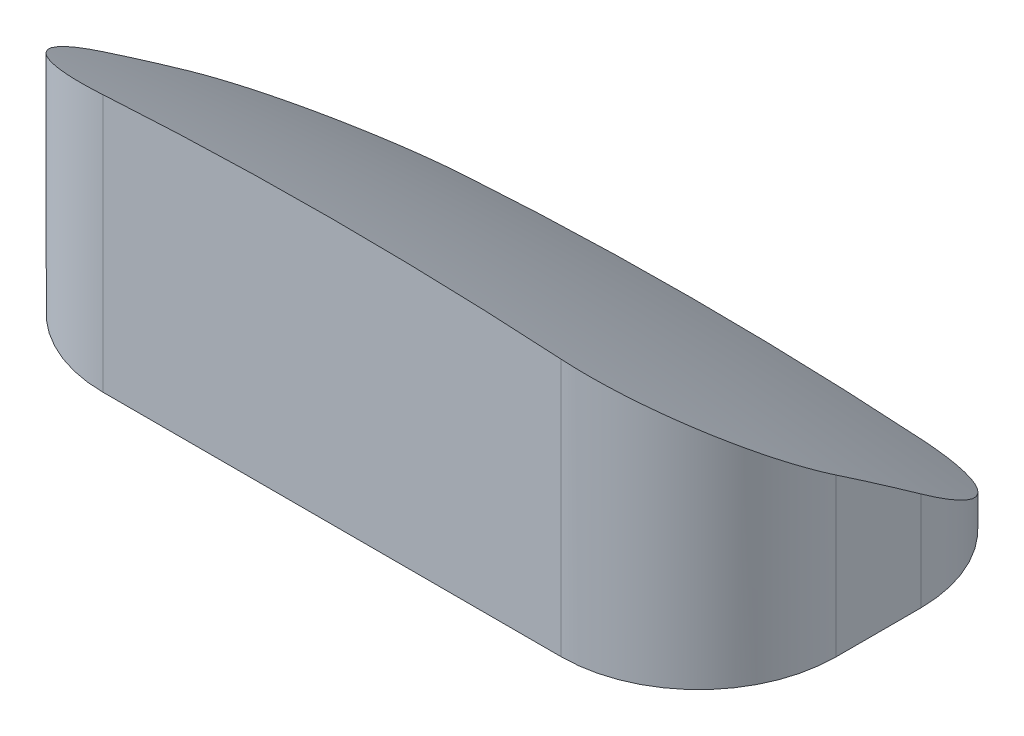
ISO-10303-21;
HEADER;
FILE_DESCRIPTION(('STEP AP214'),'2;1');
FILE_NAME('part.step','',(''),(''),'','','');
FILE_SCHEMA(('AUTOMOTIVE_DESIGN { 1 0 10303 214 1 1 1 1 }'));
ENDSEC;
DATA;
#1=APPLICATION_CONTEXT('core data for automotive mechanical design processes');
#2=APPLICATION_PROTOCOL_DEFINITION('international standard','automotive_design',2000,#1);
#3=PRODUCT_CONTEXT('',#1,'mechanical');
#4=PRODUCT('Part','Part','',(#3));
#5=PRODUCT_RELATED_PRODUCT_CATEGORY('part','',(#4));
#6=PRODUCT_DEFINITION_FORMATION('','',#4);
#7=PRODUCT_DEFINITION_CONTEXT('part definition',#1,'design');
#8=PRODUCT_DEFINITION('design','',#6,#7);
#9=PRODUCT_DEFINITION_SHAPE('','',#8);
#10=(LENGTH_UNIT() NAMED_UNIT(*) SI_UNIT(.MILLI.,.METRE.));
#11=(NAMED_UNIT(*) PLANE_ANGLE_UNIT() SI_UNIT($,.RADIAN.));
#12=(NAMED_UNIT(*) SI_UNIT($,.STERADIAN.) SOLID_ANGLE_UNIT());
#13=UNCERTAINTY_MEASURE_WITH_UNIT(LENGTH_MEASURE(1.E-05),#10,'distance_accuracy_value','');
#14=(GEOMETRIC_REPRESENTATION_CONTEXT(3) GLOBAL_UNCERTAINTY_ASSIGNED_CONTEXT((#13)) GLOBAL_UNIT_ASSIGNED_CONTEXT((#10,
#11,#12)) REPRESENTATION_CONTEXT('',''));
#15=CARTESIAN_POINT('',(0.,0.,0.));
#16=DIRECTION('',(0.,0.,1.));
#17=DIRECTION('',(1.,0.,0.));
#18=AXIS2_PLACEMENT_3D('',#15,#16,#17);
#19=CARTESIAN_POINT('',(0.,0.,0.));
#20=DIRECTION('',(-0.777145961456971,-0.629320391049837,0.));
#21=DIRECTION('',(0.629320391049837,-0.777145961456971,0.));
#22=AXIS2_PLACEMENT_3D('',#19,#20,#21);
#23=SPHERICAL_SURFACE('',#22,47.5);
#24=CARTESIAN_POINT('',(-2.4998,37.5935334833704,-28.9262379198317));
#25=CARTESIAN_POINT('',(-2.53520944975889,37.59117321094,-28.9262453312088));
#26=CARTESIAN_POINT('',(-2.57066347235647,37.5897294793148,-28.9249923751715));
#27=CARTESIAN_POINT('',(-2.64141210501423,37.5886827118056,-28.9199780942769));
#28=CARTESIAN_POINT('',(-2.67670675222086,37.5890792222062,-28.9162173879061));
#29=CARTESIAN_POINT('',(-2.78161233079084,37.5930246828713,-28.9012473266989));
#30=CARTESIAN_POINT('',(-2.85064656419669,37.5993030983977,-28.8863496864974));
#31=CARTESIAN_POINT('',(-2.98495452285183,37.6187749556692,-28.847405550785));
#32=CARTESIAN_POINT('',(-3.05022997887023,37.6319651860746,-28.8233633054247));
#33=CARTESIAN_POINT('',(-3.17560500460783,37.664526557424,-28.7672375759858));
#34=CARTESIAN_POINT('',(-3.23570018079748,37.6839028807074,-28.7351473546446));
#35=CARTESIAN_POINT('',(-3.35215845791888,37.7289063764856,-28.6626603424513));
#36=CARTESIAN_POINT('',(-3.40823630701428,37.754773427034,-28.6219573532905));
#37=CARTESIAN_POINT('',(-3.51292417124575,37.8112029385983,-28.5346761511676));
#38=CARTESIAN_POINT('',(-3.56153144453777,37.8417671153576,-28.4880957924658));
#39=CARTESIAN_POINT('',(-3.65844318580607,37.9120111762239,-28.3822584270805));
#40=CARTESIAN_POINT('',(-3.70536132740339,37.95236225106,-28.3221800967738));
#41=CARTESIAN_POINT('',(-3.78868474485569,38.0368440011621,-28.1975492607204));
#42=CARTESIAN_POINT('',(-3.82508072472022,38.0809779741459,-28.1329928607872));
#43=CARTESIAN_POINT('',(-3.89356009275104,38.1807718686923,-27.9880225616244));
#44=CARTESIAN_POINT('',(-3.92343676694983,38.2370067154407,-27.9069620878545));
#45=CARTESIAN_POINT('',(-3.96873644916546,38.3517699049491,-27.7425922475546));
#46=CARTESIAN_POINT('',(-3.98416856147893,38.4102967787904,-27.6592843316871));
#47=CARTESIAN_POINT('',(-3.99752528857246,38.5045623308457,-27.5258468164709));
#48=CARTESIAN_POINT('',(-4.00000291745447,38.5399609751,-27.4759019234515));
#49=CARTESIAN_POINT('',(-3.99999998666671,38.5754124202873,-27.4260379331651));
#50=B_SPLINE_CURVE_WITH_KNOTS('',3,(#24,#25,#26,#27,#28,#29,#30,#31,#32,#33,#34,#35,#36,#37,#38,
#39,#40,#41,#42,#43,#44,#45,#46,#47,#48,#49),.UNSPECIFIED.,.F.,.F.,(4,2,2,2,2,2,2,2,2,2,2,2,4),
(0.,0.106396457658222,0.212766684454158,0.424316286930767,0.635767687118999,0.847396695549608,
1.06844717998639,1.28957860142593,1.54737260003426,1.80539366016143,2.11347461410147,
2.42136125596033,2.60493785502519),.UNSPECIFIED.);
#51=CARTESIAN_POINT('',(-2.5,37.593520173481,-28.9262379331651));
#52=VERTEX_POINT('',#51);
#53=CARTESIAN_POINT('',(-4.,38.5752702237251,-27.4262379331651));
#54=VERTEX_POINT('',#53);
#55=EDGE_CURVE('E130',#52,#54,#50,.T.);
#56=ORIENTED_EDGE('',*,*,#55,.T.);
#57=CARTESIAN_POINT('',(-4.,0.,0.));
#58=DIRECTION('',(-1.,0.,0.));
#59=DIRECTION('',(0.,0.,1.));
#60=AXIS2_PLACEMENT_3D('',#57,#58,#59);
#61=CIRCLE('',#60,47.3312792981555);
#62=CARTESIAN_POINT('',(-4.,39.2173431022551,-26.5));
#63=VERTEX_POINT('',#62);
#64=EDGE_CURVE('E104',#54,#63,#61,.F.);
#65=ORIENTED_EDGE('',*,*,#64,.T.);
#66=CARTESIAN_POINT('',(-3.99999998666667,39.217207958582,-26.5002));
#67=CARTESIAN_POINT('',(-3.99999124906365,39.2883532245439,-26.3949265299795));
#68=CARTESIAN_POINT('',(-3.98893840417798,39.3599109124955,-26.2897721509118));
#69=CARTESIAN_POINT('',(-3.94462825763196,39.5020936237612,-26.0823841822237));
#70=CARTESIAN_POINT('',(-3.91120071561281,39.5727072301624,-25.9801793010836));
#71=CARTESIAN_POINT('',(-3.8242153268524,39.706704306967,-25.7879410009573));
#72=CARTESIAN_POINT('',(-3.77172680751546,39.7702725453661,-25.6975563285663));
#73=CARTESIAN_POINT('',(-3.64682479563077,39.891286518386,-25.5274483105653));
#74=CARTESIAN_POINT('',(-3.57449212030045,39.9487558024911,-25.447683630265));
#75=CARTESIAN_POINT('',(-3.43449148395063,40.0393804507845,-25.3240941446754));
#76=CARTESIAN_POINT('',(-3.3715253149825,40.0747605828728,-25.2765470971278));
#77=CARTESIAN_POINT('',(-3.23664863616708,40.1397510132238,-25.1909094115337));
#78=CARTESIAN_POINT('',(-3.16473529093687,40.1693594747604,-25.1528217827167));
#79=CARTESIAN_POINT('',(-3.0128236883312,40.221578383184,-25.0879472799943));
#80=CARTESIAN_POINT('',(-2.93276466799947,40.2441302106704,-25.0612544297708));
#81=CARTESIAN_POINT('',(-2.7675268359717,40.2804738518071,-25.021625056089));
#82=CARTESIAN_POINT('',(-2.68236548623432,40.2942938621921,-25.0086441618728));
#83=CARTESIAN_POINT('',(-2.58034432928249,40.3049476673273,-25.0020655417614));
#84=CARTESIAN_POINT('',(-2.56425508840762,40.3064558197349,-25.0012895319948));
#85=CARTESIAN_POINT('',(-2.53204948243395,40.3091323837825,-25.0002566274092));
#86=CARTESIAN_POINT('',(-2.51593316628803,40.3103011654169,-24.9999991654181));
#87=CARTESIAN_POINT('',(-2.4998,40.3113011361992,-25.0000000133333));
#88=B_SPLINE_CURVE_WITH_KNOTS('',3,(#66,#67,#68,#69,#70,#71,#72,#73,#74,#75,#76,#77,#78,#79,#80,
#81,#82,#83,#84,#85,#86,#87),.UNSPECIFIED.,.F.,.F.,(4,2,2,2,2,2,2,2,2,2,4),(0.,
0.380935973786761,0.764803795100647,1.12981809938373,1.49336736775669,1.75176678972226,
2.01024830870213,2.27082328154961,2.53055244777706,2.57908217389863,2.62755879075752),.UNSPECIFIED.);
#89=CARTESIAN_POINT('',(-2.5,40.3112887414928,-25.));
#90=VERTEX_POINT('',#89);
#91=EDGE_CURVE('E86',#63,#90,#88,.T.);
#92=ORIENTED_EDGE('',*,*,#91,.T.);
#93=CARTESIAN_POINT('',(0.,0.,-25.));
#94=DIRECTION('',(0.,0.,1.));
#95=DIRECTION('',(1.,0.,0.));
#96=AXIS2_PLACEMENT_3D('',#93,#94,#95);
#97=CIRCLE('',#96,40.3887360535088);
#98=CARTESIAN_POINT('',(2.5,40.3112887414928,-25.));
#99=VERTEX_POINT('',#98);
#100=EDGE_CURVE('E94',#90,#99,#97,.F.);
#101=ORIENTED_EDGE('',*,*,#100,.T.);
#102=CARTESIAN_POINT('',(2.4998,40.3113011361992,-25.0000000133333));
#103=CARTESIAN_POINT('',(2.53808731491998,40.3089318659406,-24.9999919290323));
#104=CARTESIAN_POINT('',(2.57629174119379,40.3055994996072,-25.0014567276817));
#105=CARTESIAN_POINT('',(2.65224997789733,40.297070970257,-25.007261158581));
#106=CARTESIAN_POINT('',(2.69000403776087,40.2918758936327,-25.011599116359));
#107=CARTESIAN_POINT('',(2.80174356684413,40.2736636321839,-25.0287443048325));
#108=CARTESIAN_POINT('',(2.87471157742311,40.2579868472196,-25.0456848062941));
#109=CARTESIAN_POINT('',(3.0156409021242,40.2203882168381,-25.0894814415226));
#110=CARTESIAN_POINT('',(3.08361181991853,40.1984787666548,-25.1163179256942));
#111=CARTESIAN_POINT('',(3.21348610583967,40.1493217774468,-25.1785874389976));
#112=CARTESIAN_POINT('',(3.27538115606094,40.1220670695369,-25.2140320284236));
#113=CARTESIAN_POINT('',(3.39691619088874,40.0607766891457,-25.295294374413));
#114=CARTESIAN_POINT('',(3.4559562322908,40.0263684536423,-25.3417239763789));
#115=CARTESIAN_POINT('',(3.56518419715355,39.9535556627561,-25.4412980429794));
#116=CARTESIAN_POINT('',(3.61537053349617,39.9151503928214,-25.4944437086131));
#117=CARTESIAN_POINT('',(3.71429217939118,39.8285862671769,-25.6153664744366));
#118=CARTESIAN_POINT('',(3.76136951897672,39.7798723707601,-25.6841020700315));
#119=CARTESIAN_POINT('',(3.84296974550585,39.6795584323428,-25.8267985321457));
#120=CARTESIAN_POINT('',(3.87747707804501,39.6279549050871,-25.9007657382002));
#121=CARTESIAN_POINT('',(3.93712095190012,39.516955352749,-26.0609062488058));
#122=CARTESIAN_POINT('',(3.96072054746856,39.4573463420056,-26.147504218603));
#123=CARTESIAN_POINT('',(3.99214042443122,39.3374669472151,-26.3227673715864));
#124=CARTESIAN_POINT('',(3.99999870257543,39.2771985096949,-26.4114270530547));
#125=CARTESIAN_POINT('',(3.99999998666667,39.217207958582,-26.5002));
#126=B_SPLINE_CURVE_WITH_KNOTS('',3,(#102,#103,#104,#105,#106,#107,#108,#109,#110,#111,#112,
#113,#114,#115,#116,#117,#118,#119,#120,#121,#122,#123,#124,#125),.UNSPECIFIED.,.F.,.F.,(4,2,2,
2,2,2,2,2,2,2,2,4),(0.,0.114997659170289,0.22992835681922,0.45829272661488,0.686206073510256,
0.914427206841945,1.16134122488873,1.40829945994755,1.69671616940783,1.98548856935572,
2.30751892021152,2.62877100565242),.UNSPECIFIED.);
#127=CARTESIAN_POINT('',(4.,39.2173431022556,-26.5));
#128=VERTEX_POINT('',#127);
#129=EDGE_CURVE('E100',#99,#128,#126,.T.);
#130=ORIENTED_EDGE('',*,*,#129,.T.);
#131=CARTESIAN_POINT('',(4.,0.,0.));
#132=DIRECTION('',(1.,0.,0.));
#133=DIRECTION('',(0.,0.,-1.));
#134=AXIS2_PLACEMENT_3D('',#131,#132,#133);
#135=CIRCLE('',#134,47.3312792981555);
#136=CARTESIAN_POINT('',(4.,38.5752702237251,-27.4262379331651));
#137=VERTEX_POINT('',#136);
#138=EDGE_CURVE('E148',#128,#137,#135,.F.);
#139=ORIENTED_EDGE('',*,*,#138,.T.);
#140=CARTESIAN_POINT('',(3.99999998666666,38.5754124202873,-27.4260379331651));
#141=CARTESIAN_POINT('',(3.99999201213011,38.5018377516732,-27.5295372333869));
#142=CARTESIAN_POINT('',(3.98930058510811,38.4283884091794,-27.6335090209742));
#143=CARTESIAN_POINT('',(3.94583217101404,38.2839622227849,-27.8394476967561));
#144=CARTESIAN_POINT('',(3.91291996126435,38.2130033321723,-27.9413983521241));
#145=CARTESIAN_POINT('',(3.83379267522696,38.0913771862531,-28.1177729470218));
#146=CARTESIAN_POINT('',(3.79195122970055,38.0396243856603,-28.1934071200829));
#147=CARTESIAN_POINT('',(3.69398545440829,37.9414041577229,-28.3383897176493));
#148=CARTESIAN_POINT('',(3.63790225496229,37.8949220584783,-28.4077554761606));
#149=CARTESIAN_POINT('',(3.52289638457148,37.8169315801912,-28.525876936616));
#150=CARTESIAN_POINT('',(3.46628987887234,37.7842330433833,-28.5760972614832));
#151=CARTESIAN_POINT('',(3.34396650002767,37.7250981266013,-28.6686519679537));
#152=CARTESIAN_POINT('',(3.27824977858077,37.6986616423746,-28.71098648084));
#153=CARTESIAN_POINT('',(3.13832882134621,37.6533583180983,-28.7859752426467));
#154=CARTESIAN_POINT('',(3.06406122243692,37.6345533714224,-28.818549801));
#155=CARTESIAN_POINT('',(2.90966894713573,37.6062083027914,-28.8715041999484));
#156=CARTESIAN_POINT('',(2.82955519934297,37.5966513470561,-28.8919061717932));
#157=CARTESIAN_POINT('',(2.70713517644175,37.5898018118699,-28.9124534109813));
#158=CARTESIAN_POINT('',(2.66580130975622,37.5887762221751,-28.9176267961145));
#159=CARTESIAN_POINT('',(2.58289211270906,37.5892584536836,-28.9245232299411));
#160=CARTESIAN_POINT('',(2.54131698314102,37.590764405109,-28.9262488230888));
#161=CARTESIAN_POINT('',(2.4998,37.5935334833704,-28.9262379198317));
#162=B_SPLINE_CURVE_WITH_KNOTS('',3,(#140,#141,#142,#143,#144,#145,#146,#147,#148,#149,#150,
#151,#152,#153,#154,#155,#156,#157,#158,#159,#160,#161),.UNSPECIFIED.,.F.,.F.,(4,2,2,2,2,2,2,2,
2,2,4),(0.,0.381042410249836,0.764424774989711,1.06548962015082,1.36569468397045,
1.61201992507766,1.85834106499632,2.10662180980764,2.35444976333539,2.4792620254412,
2.60398214261185),.UNSPECIFIED.);
#163=CARTESIAN_POINT('',(2.5,37.593520173481,-28.9262379331651));
#164=VERTEX_POINT('',#163);
#165=EDGE_CURVE('E138',#137,#164,#162,.T.);
#166=ORIENTED_EDGE('',*,*,#165,.T.);
#167=CARTESIAN_POINT('',(0.,0.,-28.9262379331651));
#168=DIRECTION('',(0.,0.,-1.));
#169=DIRECTION('',(-1.,0.,0.));
#170=AXIS2_PLACEMENT_3D('',#167,#168,#169);
#171=CIRCLE('',#170,37.6765545005633);
#172=EDGE_CURVE('E170',#164,#52,#171,.F.);
#173=ORIENTED_EDGE('',*,*,#172,.T.);
#174=EDGE_LOOP('',(#56,#65,#92,#101,#130,#139,#166,#173));
#175=FACE_BOUND('',#174,.T.);
#176=ADVANCED_FACE('F16',(#175),#23,.T.);
#177=CARTESIAN_POINT('',(-4.,470.25,-26.5));
#178=DIRECTION('',(-1.,0.,0.));
#179=DIRECTION('',(0.,0.,1.));
#180=AXIS2_PLACEMENT_3D('',#177,#178,#179);
#181=PLANE('',#180);
#182=ORIENTED_EDGE('',*,*,#64,.F.);
#183=DIRECTION('',(0.,-1.,0.));
#184=VECTOR('',#183,1.);
#185=CARTESIAN_POINT('',(-4.,470.25,-27.4262379331651));
#186=LINE('',#185,#184);
#187=CARTESIAN_POINT('',(-4.,37.5,-27.4262379331651));
#188=VERTEX_POINT('',#187);
#189=EDGE_CURVE('E42',#54,#188,#186,.T.);
#190=ORIENTED_EDGE('',*,*,#189,.T.);
#191=DIRECTION('',(0.,0.,-1.));
#192=VECTOR('',#191,1.);
#193=CARTESIAN_POINT('',(-4.,37.5,-26.5));
#194=LINE('',#193,#192);
#195=CARTESIAN_POINT('',(-4.,37.5,-26.5));
#196=VERTEX_POINT('',#195);
#197=EDGE_CURVE('E10',#196,#188,#194,.T.);
#198=ORIENTED_EDGE('',*,*,#197,.F.);
#199=DIRECTION('',(0.,-1.,0.));
#200=VECTOR('',#199,1.);
#201=CARTESIAN_POINT('',(-4.,470.25,-26.5));
#202=LINE('',#201,#200);
#203=EDGE_CURVE('E21',#63,#196,#202,.T.);
#204=ORIENTED_EDGE('',*,*,#203,.F.);
#205=EDGE_LOOP('',(#182,#190,#198,#204));
#206=FACE_BOUND('',#205,.T.);
#207=ADVANCED_FACE('F122',(#206),#181,.T.);
#208=CARTESIAN_POINT('',(-2.5,470.25,-28.9262379331651));
#209=DIRECTION('',(0.,0.,-1.));
#210=DIRECTION('',(-1.,0.,0.));
#211=AXIS2_PLACEMENT_3D('',#208,#209,#210);
#212=PLANE('',#211);
#213=ORIENTED_EDGE('',*,*,#172,.F.);
#214=DIRECTION('',(0.,-1.,0.));
#215=VECTOR('',#214,1.);
#216=CARTESIAN_POINT('',(2.5,470.25,-28.9262379331651));
#217=LINE('',#216,#215);
#218=CARTESIAN_POINT('',(2.5,37.5,-28.9262379331651));
#219=VERTEX_POINT('',#218);
#220=EDGE_CURVE('E196',#164,#219,#217,.T.);
#221=ORIENTED_EDGE('',*,*,#220,.T.);
#222=DIRECTION('',(1.,0.,0.));
#223=VECTOR('',#222,1.);
#224=CARTESIAN_POINT('',(-2.5,37.5,-28.9262379331651));
#225=LINE('',#224,#223);
#226=CARTESIAN_POINT('',(-2.5,37.5,-28.9262379331651));
#227=VERTEX_POINT('',#226);
#228=EDGE_CURVE('E204',#227,#219,#225,.T.);
#229=ORIENTED_EDGE('',*,*,#228,.F.);
#230=DIRECTION('',(0.,-1.,0.));
#231=VECTOR('',#230,1.);
#232=CARTESIAN_POINT('',(-2.5,470.25,-28.9262379331651));
#233=LINE('',#232,#231);
#234=EDGE_CURVE('E202',#52,#227,#233,.T.);
#235=ORIENTED_EDGE('',*,*,#234,.F.);
#236=EDGE_LOOP('',(#213,#221,#229,#235));
#237=FACE_BOUND('',#236,.T.);
#238=ADVANCED_FACE('F159',(#237),#212,.T.);
#239=CARTESIAN_POINT('',(4.,470.25,-27.4262379331651));
#240=DIRECTION('',(1.,0.,0.));
#241=DIRECTION('',(0.,0.,-1.));
#242=AXIS2_PLACEMENT_3D('',#239,#240,#241);
#243=PLANE('',#242);
#244=ORIENTED_EDGE('',*,*,#138,.F.);
#245=DIRECTION('',(0.,-1.,0.));
#246=VECTOR('',#245,1.);
#247=CARTESIAN_POINT('',(4.,470.25,-26.5));
#248=LINE('',#247,#246);
#249=CARTESIAN_POINT('',(4.,37.5,-26.5));
#250=VERTEX_POINT('',#249);
#251=EDGE_CURVE('E187',#128,#250,#248,.T.);
#252=ORIENTED_EDGE('',*,*,#251,.T.);
#253=DIRECTION('',(0.,0.,1.));
#254=VECTOR('',#253,1.);
#255=CARTESIAN_POINT('',(4.,37.5,-27.4262379331651));
#256=LINE('',#255,#254);
#257=CARTESIAN_POINT('',(4.,37.5,-27.4262379331651));
#258=VERTEX_POINT('',#257);
#259=EDGE_CURVE('E191',#258,#250,#256,.T.);
#260=ORIENTED_EDGE('',*,*,#259,.F.);
#261=DIRECTION('',(0.,-1.,0.));
#262=VECTOR('',#261,1.);
#263=CARTESIAN_POINT('',(4.,470.25,-27.4262379331651));
#264=LINE('',#263,#262);
#265=EDGE_CURVE('E189',#137,#258,#264,.T.);
#266=ORIENTED_EDGE('',*,*,#265,.F.);
#267=EDGE_LOOP('',(#244,#252,#260,#266));
#268=FACE_BOUND('',#267,.T.);
#269=ADVANCED_FACE('F156',(#268),#243,.T.);
#270=CARTESIAN_POINT('',(2.5,470.25,-25.));
#271=DIRECTION('',(0.,0.,1.));
#272=DIRECTION('',(1.,0.,0.));
#273=AXIS2_PLACEMENT_3D('',#270,#271,#272);
#274=PLANE('',#273);
#275=ORIENTED_EDGE('',*,*,#100,.F.);
#276=DIRECTION('',(0.,-1.,0.));
#277=VECTOR('',#276,1.);
#278=CARTESIAN_POINT('',(-2.5,470.25,-25.));
#279=LINE('',#278,#277);
#280=CARTESIAN_POINT('',(-2.5,37.5,-25.));
#281=VERTEX_POINT('',#280);
#282=EDGE_CURVE('E83',#90,#281,#279,.T.);
#283=ORIENTED_EDGE('',*,*,#282,.T.);
#284=DIRECTION('',(-1.,0.,0.));
#285=VECTOR('',#284,1.);
#286=CARTESIAN_POINT('',(2.5,37.5,-25.));
#287=LINE('',#286,#285);
#288=CARTESIAN_POINT('',(2.5,37.5,-25.));
#289=VERTEX_POINT('',#288);
#290=EDGE_CURVE('E216',#289,#281,#287,.T.);
#291=ORIENTED_EDGE('',*,*,#290,.F.);
#292=DIRECTION('',(0.,-1.,0.));
#293=VECTOR('',#292,1.);
#294=CARTESIAN_POINT('',(2.5,470.25,-25.));
#295=LINE('',#294,#293);
#296=EDGE_CURVE('E92',#99,#289,#295,.T.);
#297=ORIENTED_EDGE('',*,*,#296,.F.);
#298=EDGE_LOOP('',(#275,#283,#291,#297));
#299=FACE_BOUND('',#298,.T.);
#300=ADVANCED_FACE('F95',(#299),#274,.T.);
#301=CARTESIAN_POINT('',(-2.5,470.25,-27.4262379331651));
#302=DIRECTION('',(0.,-1.,0.));
#303=DIRECTION('',(0.,0.,-1.));
#304=AXIS2_PLACEMENT_3D('',#301,#302,#303);
#305=CYLINDRICAL_SURFACE('',#304,1.5);
#306=ORIENTED_EDGE('',*,*,#55,.F.);
#307=ORIENTED_EDGE('',*,*,#234,.T.);
#308=CARTESIAN_POINT('',(-2.5,37.5,-27.4262379331651));
#309=DIRECTION('',(0.,-1.,0.));
#310=DIRECTION('',(1.,0.,0.));
#311=AXIS2_PLACEMENT_3D('',#308,#309,#310);
#312=CIRCLE('',#311,1.5);
#313=EDGE_CURVE('E27',#188,#227,#312,.T.);
#314=ORIENTED_EDGE('',*,*,#313,.F.);
#315=ORIENTED_EDGE('',*,*,#189,.F.);
#316=EDGE_LOOP('',(#306,#307,#314,#315));
#317=FACE_BOUND('',#316,.T.);
#318=ADVANCED_FACE('F124',(#317),#305,.T.);
#319=CARTESIAN_POINT('',(2.5,470.25,-27.4262379331651));
#320=DIRECTION('',(0.,-1.,0.));
#321=DIRECTION('',(0.,0.,-1.));
#322=AXIS2_PLACEMENT_3D('',#319,#320,#321);
#323=CYLINDRICAL_SURFACE('',#322,1.5);
#324=ORIENTED_EDGE('',*,*,#165,.F.);
#325=ORIENTED_EDGE('',*,*,#265,.T.);
#326=CARTESIAN_POINT('',(2.5,37.5,-27.4262379331651));
#327=DIRECTION('',(0.,-1.,0.));
#328=DIRECTION('',(1.,0.,0.));
#329=AXIS2_PLACEMENT_3D('',#326,#327,#328);
#330=CIRCLE('',#329,1.5);
#331=EDGE_CURVE('E198',#219,#258,#330,.T.);
#332=ORIENTED_EDGE('',*,*,#331,.F.);
#333=ORIENTED_EDGE('',*,*,#220,.F.);
#334=EDGE_LOOP('',(#324,#325,#332,#333));
#335=FACE_BOUND('',#334,.T.);
#336=ADVANCED_FACE('F154',(#335),#323,.T.);
#337=CARTESIAN_POINT('',(2.5,470.25,-26.5));
#338=DIRECTION('',(0.,-1.,0.));
#339=DIRECTION('',(0.,0.,-1.));
#340=AXIS2_PLACEMENT_3D('',#337,#338,#339);
#341=CYLINDRICAL_SURFACE('',#340,1.5);
#342=ORIENTED_EDGE('',*,*,#129,.F.);
#343=ORIENTED_EDGE('',*,*,#296,.T.);
#344=CARTESIAN_POINT('',(2.5,37.5,-26.5));
#345=DIRECTION('',(0.,-1.,0.));
#346=DIRECTION('',(1.,0.,0.));
#347=AXIS2_PLACEMENT_3D('',#344,#345,#346);
#348=CIRCLE('',#347,1.5);
#349=EDGE_CURVE('E215',#250,#289,#348,.T.);
#350=ORIENTED_EDGE('',*,*,#349,.F.);
#351=ORIENTED_EDGE('',*,*,#251,.F.);
#352=EDGE_LOOP('',(#342,#343,#350,#351));
#353=FACE_BOUND('',#352,.T.);
#354=ADVANCED_FACE('F149',(#353),#341,.T.);
#355=CARTESIAN_POINT('',(-2.5,470.25,-26.5));
#356=DIRECTION('',(0.,-1.,0.));
#357=DIRECTION('',(0.,0.,-1.));
#358=AXIS2_PLACEMENT_3D('',#355,#356,#357);
#359=CYLINDRICAL_SURFACE('',#358,1.5);
#360=ORIENTED_EDGE('',*,*,#91,.F.);
#361=ORIENTED_EDGE('',*,*,#203,.T.);
#362=CARTESIAN_POINT('',(-2.5,37.5,-26.5));
#363=DIRECTION('',(0.,-1.,0.));
#364=DIRECTION('',(1.,0.,0.));
#365=AXIS2_PLACEMENT_3D('',#362,#363,#364);
#366=CIRCLE('',#365,1.5);
#367=EDGE_CURVE('E87',#281,#196,#366,.T.);
#368=ORIENTED_EDGE('',*,*,#367,.F.);
#369=ORIENTED_EDGE('',*,*,#282,.F.);
#370=EDGE_LOOP('',(#360,#361,#368,#369));
#371=FACE_BOUND('',#370,.T.);
#372=ADVANCED_FACE('F18',(#371),#359,.T.);
#373=CARTESIAN_POINT('',(-2.5,37.5,-27.4262379331651));
#374=DIRECTION('',(0.,-1.,0.));
#375=DIRECTION('',(0.,0.,-1.));
#376=AXIS2_PLACEMENT_3D('',#373,#374,#375);
#377=PLANE('',#376);
#378=ORIENTED_EDGE('',*,*,#197,.T.);
#379=ORIENTED_EDGE('',*,*,#313,.T.);
#380=ORIENTED_EDGE('',*,*,#228,.T.);
#381=ORIENTED_EDGE('',*,*,#331,.T.);
#382=ORIENTED_EDGE('',*,*,#259,.T.);
#383=ORIENTED_EDGE('',*,*,#349,.T.);
#384=ORIENTED_EDGE('',*,*,#290,.T.);
#385=ORIENTED_EDGE('',*,*,#367,.T.);
#386=EDGE_LOOP('',(#378,#379,#380,#381,#382,#383,#384,#385));
#387=FACE_BOUND('',#386,.T.);
#388=ADVANCED_FACE('F123',(#387),#377,.T.);
#389=CLOSED_SHELL('',(#176,#207,#238,#269,#300,#318,#336,#354,#372,#388));
#390=MANIFOLD_SOLID_BREP('B1',#389);
#391=ADVANCED_BREP_SHAPE_REPRESENTATION('',(#18,#390),#14);
#392=SHAPE_DEFINITION_REPRESENTATION(#9,#391);
ENDSEC;
END-ISO-10303-21;
